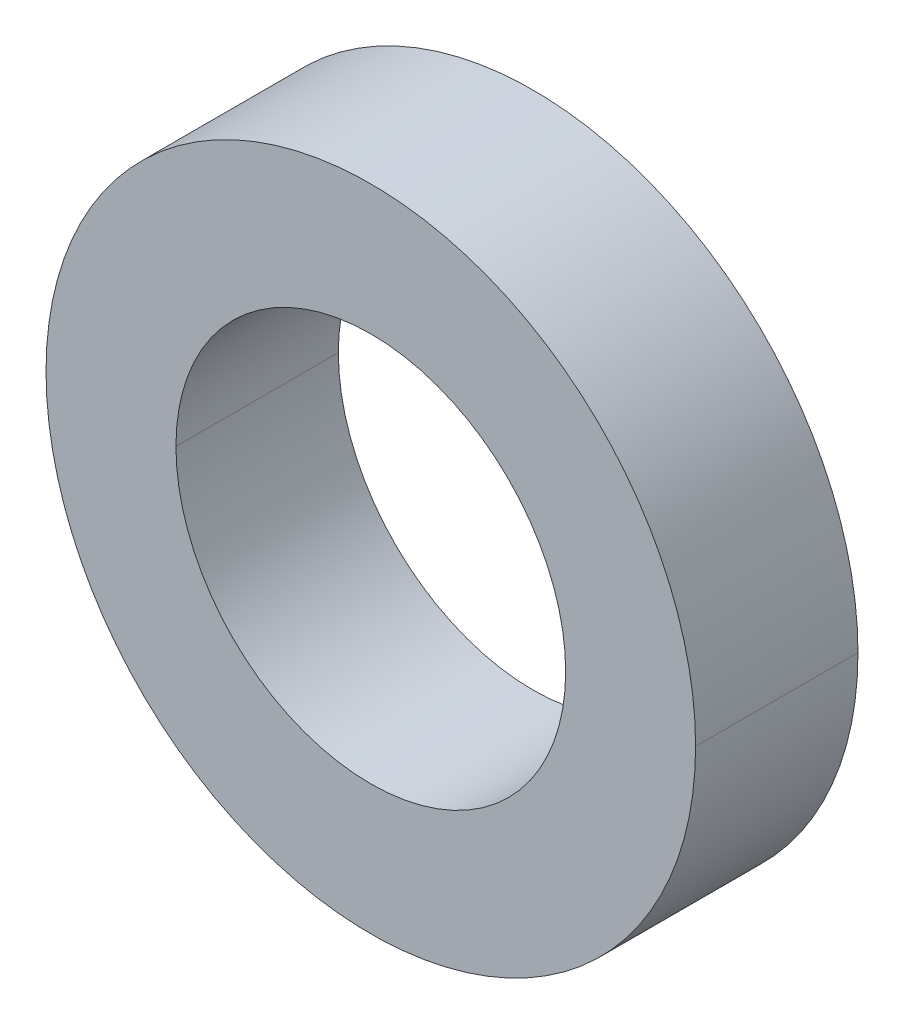
ISO-10303-21;
HEADER;
FILE_DESCRIPTION(('STEP AP214'),'2;1');
FILE_NAME('part.step','',(''),(''),'','','');
FILE_SCHEMA(('AUTOMOTIVE_DESIGN { 1 0 10303 214 1 1 1 1 }'));
ENDSEC;
DATA;
#1=APPLICATION_CONTEXT('core data for automotive mechanical design processes');
#2=APPLICATION_PROTOCOL_DEFINITION('international standard','automotive_design',2000,#1);
#3=PRODUCT_CONTEXT('',#1,'mechanical');
#4=PRODUCT('Part','Part','',(#3));
#5=PRODUCT_RELATED_PRODUCT_CATEGORY('part','',(#4));
#6=PRODUCT_DEFINITION_FORMATION('','',#4);
#7=PRODUCT_DEFINITION_CONTEXT('part definition',#1,'design');
#8=PRODUCT_DEFINITION('design','',#6,#7);
#9=PRODUCT_DEFINITION_SHAPE('','',#8);
#10=(LENGTH_UNIT() NAMED_UNIT(*) SI_UNIT(.MILLI.,.METRE.));
#11=(NAMED_UNIT(*) PLANE_ANGLE_UNIT() SI_UNIT($,.RADIAN.));
#12=(NAMED_UNIT(*) SI_UNIT($,.STERADIAN.) SOLID_ANGLE_UNIT());
#13=UNCERTAINTY_MEASURE_WITH_UNIT(LENGTH_MEASURE(1.E-05),#10,'distance_accuracy_value','');
#14=(GEOMETRIC_REPRESENTATION_CONTEXT(3) GLOBAL_UNCERTAINTY_ASSIGNED_CONTEXT((#13)) GLOBAL_UNIT_ASSIGNED_CONTEXT((#10,
#11,#12)) REPRESENTATION_CONTEXT('',''));
#15=CARTESIAN_POINT('',(0.,0.,0.));
#16=DIRECTION('',(0.,0.,1.));
#17=DIRECTION('',(1.,0.,0.));
#18=AXIS2_PLACEMENT_3D('',#15,#16,#17);
#19=CARTESIAN_POINT('',(0.,0.,-1.25));
#20=DIRECTION('',(0.,0.,1.));
#21=DIRECTION('',(1.,0.,0.));
#22=AXIS2_PLACEMENT_3D('',#19,#20,#21);
#23=CYLINDRICAL_SURFACE('',#22,3.);
#24=DIRECTION('',(0.,0.,1.));
#25=VECTOR('',#24,1.);
#26=CARTESIAN_POINT('',(3.,0.,-1.25));
#27=LINE('',#26,#25);
#28=CARTESIAN_POINT('',(3.,0.,-1.25));
#29=VERTEX_POINT('',#28);
#30=CARTESIAN_POINT('',(3.,0.,1.25));
#31=VERTEX_POINT('',#30);
#32=EDGE_CURVE('E11',#29,#31,#27,.T.);
#33=ORIENTED_EDGE('',*,*,#32,.T.);
#34=CARTESIAN_POINT('',(0.,0.,1.25));
#35=DIRECTION('',(0.,0.,1.));
#36=DIRECTION('',(1.,0.,0.));
#37=AXIS2_PLACEMENT_3D('',#34,#35,#36);
#38=CIRCLE('',#37,3.);
#39=CARTESIAN_POINT('',(-3.,0.,1.25));
#40=VERTEX_POINT('',#39);
#41=EDGE_CURVE('E99',#31,#40,#38,.T.);
#42=ORIENTED_EDGE('',*,*,#41,.T.);
#43=DIRECTION('',(0.,0.,1.));
#44=VECTOR('',#43,1.);
#45=CARTESIAN_POINT('',(-3.,0.,-1.25));
#46=LINE('',#45,#44);
#47=CARTESIAN_POINT('',(-3.,0.,-1.25));
#48=VERTEX_POINT('',#47);
#49=EDGE_CURVE('E27',#48,#40,#46,.T.);
#50=ORIENTED_EDGE('',*,*,#49,.F.);
#51=CARTESIAN_POINT('',(0.,0.,-1.25));
#52=DIRECTION('',(0.,0.,-1.));
#53=DIRECTION('',(-1.,0.,0.));
#54=AXIS2_PLACEMENT_3D('',#51,#52,#53);
#55=CIRCLE('',#54,3.);
#56=EDGE_CURVE('E88',#48,#29,#55,.T.);
#57=ORIENTED_EDGE('',*,*,#56,.T.);
#58=EDGE_LOOP('',(#33,#42,#50,#57));
#59=FACE_BOUND('',#58,.T.);
#60=ADVANCED_FACE('F16',(#59),#23,.F.);
#61=CARTESIAN_POINT('',(0.,0.,-1.25));
#62=DIRECTION('',(0.,0.,1.));
#63=DIRECTION('',(1.,0.,0.));
#64=AXIS2_PLACEMENT_3D('',#61,#62,#63);
#65=CYLINDRICAL_SURFACE('',#64,3.);
#66=ORIENTED_EDGE('',*,*,#49,.T.);
#67=CARTESIAN_POINT('',(0.,0.,1.25));
#68=DIRECTION('',(0.,0.,1.));
#69=DIRECTION('',(-1.,0.,0.));
#70=AXIS2_PLACEMENT_3D('',#67,#68,#69);
#71=CIRCLE('',#70,3.);
#72=EDGE_CURVE('E98',#40,#31,#71,.T.);
#73=ORIENTED_EDGE('',*,*,#72,.T.);
#74=ORIENTED_EDGE('',*,*,#32,.F.);
#75=CARTESIAN_POINT('',(0.,0.,-1.25));
#76=DIRECTION('',(0.,0.,-1.));
#77=DIRECTION('',(1.,0.,0.));
#78=AXIS2_PLACEMENT_3D('',#75,#76,#77);
#79=CIRCLE('',#78,3.);
#80=EDGE_CURVE('E84',#29,#48,#79,.T.);
#81=ORIENTED_EDGE('',*,*,#80,.T.);
#82=EDGE_LOOP('',(#66,#73,#74,#81));
#83=FACE_BOUND('',#82,.T.);
#84=ADVANCED_FACE('F110',(#83),#65,.F.);
#85=CARTESIAN_POINT('',(0.,0.,1.25));
#86=DIRECTION('',(0.,0.,1.));
#87=DIRECTION('',(1.,0.,0.));
#88=AXIS2_PLACEMENT_3D('',#85,#86,#87);
#89=PLANE('',#88);
#90=ORIENTED_EDGE('',*,*,#41,.F.);
#91=ORIENTED_EDGE('',*,*,#72,.F.);
#92=EDGE_LOOP('',(#90,#91));
#93=FACE_BOUND('',#92,.T.);
#94=CARTESIAN_POINT('',(0.,0.,1.25));
#95=DIRECTION('',(0.,0.,-1.));
#96=DIRECTION('',(1.,0.,0.));
#97=AXIS2_PLACEMENT_3D('',#94,#95,#96);
#98=CIRCLE('',#97,5.);
#99=CARTESIAN_POINT('',(5.,0.,1.25));
#100=VERTEX_POINT('',#99);
#101=CARTESIAN_POINT('',(-5.,0.,1.25));
#102=VERTEX_POINT('',#101);
#103=EDGE_CURVE('E20',#100,#102,#98,.T.);
#104=ORIENTED_EDGE('',*,*,#103,.F.);
#105=CARTESIAN_POINT('',(0.,0.,1.25));
#106=DIRECTION('',(0.,0.,-1.));
#107=DIRECTION('',(-1.,0.,0.));
#108=AXIS2_PLACEMENT_3D('',#105,#106,#107);
#109=CIRCLE('',#108,5.);
#110=EDGE_CURVE('E83',#102,#100,#109,.T.);
#111=ORIENTED_EDGE('',*,*,#110,.F.);
#112=EDGE_LOOP('',(#104,#111));
#113=FACE_BOUND('',#112,.T.);
#114=ADVANCED_FACE('F112',(#93,#113),#89,.T.);
#115=CARTESIAN_POINT('',(0.,0.,-1.25));
#116=DIRECTION('',(0.,0.,1.));
#117=DIRECTION('',(1.,0.,0.));
#118=AXIS2_PLACEMENT_3D('',#115,#116,#117);
#119=CYLINDRICAL_SURFACE('',#118,5.);
#120=DIRECTION('',(0.,0.,1.));
#121=VECTOR('',#120,1.);
#122=CARTESIAN_POINT('',(5.,0.,-1.25));
#123=LINE('',#122,#121);
#124=CARTESIAN_POINT('',(5.,0.,-1.25));
#125=VERTEX_POINT('',#124);
#126=EDGE_CURVE('E73',#125,#100,#123,.T.);
#127=ORIENTED_EDGE('',*,*,#126,.T.);
#128=ORIENTED_EDGE('',*,*,#103,.T.);
#129=DIRECTION('',(0.,0.,1.));
#130=VECTOR('',#129,1.);
#131=CARTESIAN_POINT('',(-5.,0.,-1.25));
#132=LINE('',#131,#130);
#133=CARTESIAN_POINT('',(-5.,0.,-1.25));
#134=VERTEX_POINT('',#133);
#135=EDGE_CURVE('E78',#134,#102,#132,.T.);
#136=ORIENTED_EDGE('',*,*,#135,.F.);
#137=CARTESIAN_POINT('',(0.,0.,-1.25));
#138=DIRECTION('',(0.,0.,1.));
#139=DIRECTION('',(-1.,0.,0.));
#140=AXIS2_PLACEMENT_3D('',#137,#138,#139);
#141=CIRCLE('',#140,5.);
#142=EDGE_CURVE('E81',#134,#125,#141,.T.);
#143=ORIENTED_EDGE('',*,*,#142,.T.);
#144=EDGE_LOOP('',(#127,#128,#136,#143));
#145=FACE_BOUND('',#144,.T.);
#146=ADVANCED_FACE('F79',(#145),#119,.T.);
#147=CARTESIAN_POINT('',(0.,0.,-1.25));
#148=DIRECTION('',(0.,0.,1.));
#149=DIRECTION('',(1.,0.,0.));
#150=AXIS2_PLACEMENT_3D('',#147,#148,#149);
#151=CYLINDRICAL_SURFACE('',#150,5.);
#152=ORIENTED_EDGE('',*,*,#135,.T.);
#153=ORIENTED_EDGE('',*,*,#110,.T.);
#154=ORIENTED_EDGE('',*,*,#126,.F.);
#155=CARTESIAN_POINT('',(0.,0.,-1.25));
#156=DIRECTION('',(0.,0.,1.));
#157=DIRECTION('',(1.,0.,0.));
#158=AXIS2_PLACEMENT_3D('',#155,#156,#157);
#159=CIRCLE('',#158,5.);
#160=EDGE_CURVE('E85',#125,#134,#159,.T.);
#161=ORIENTED_EDGE('',*,*,#160,.T.);
#162=EDGE_LOOP('',(#152,#153,#154,#161));
#163=FACE_BOUND('',#162,.T.);
#164=ADVANCED_FACE('F18',(#163),#151,.T.);
#165=CARTESIAN_POINT('',(0.,0.,-1.25));
#166=DIRECTION('',(0.,0.,1.));
#167=DIRECTION('',(1.,0.,0.));
#168=AXIS2_PLACEMENT_3D('',#165,#166,#167);
#169=PLANE('',#168);
#170=ORIENTED_EDGE('',*,*,#56,.F.);
#171=ORIENTED_EDGE('',*,*,#80,.F.);
#172=EDGE_LOOP('',(#170,#171));
#173=FACE_BOUND('',#172,.T.);
#174=ORIENTED_EDGE('',*,*,#142,.F.);
#175=ORIENTED_EDGE('',*,*,#160,.F.);
#176=EDGE_LOOP('',(#174,#175));
#177=FACE_BOUND('',#176,.T.);
#178=ADVANCED_FACE('F90',(#173,#177),#169,.F.);
#179=CLOSED_SHELL('',(#60,#84,#114,#146,#164,#178));
#180=MANIFOLD_SOLID_BREP('B1',#179);
#181=ADVANCED_BREP_SHAPE_REPRESENTATION('',(#18,#180),#14);
#182=SHAPE_DEFINITION_REPRESENTATION(#9,#181);
ENDSEC;
END-ISO-10303-21;
